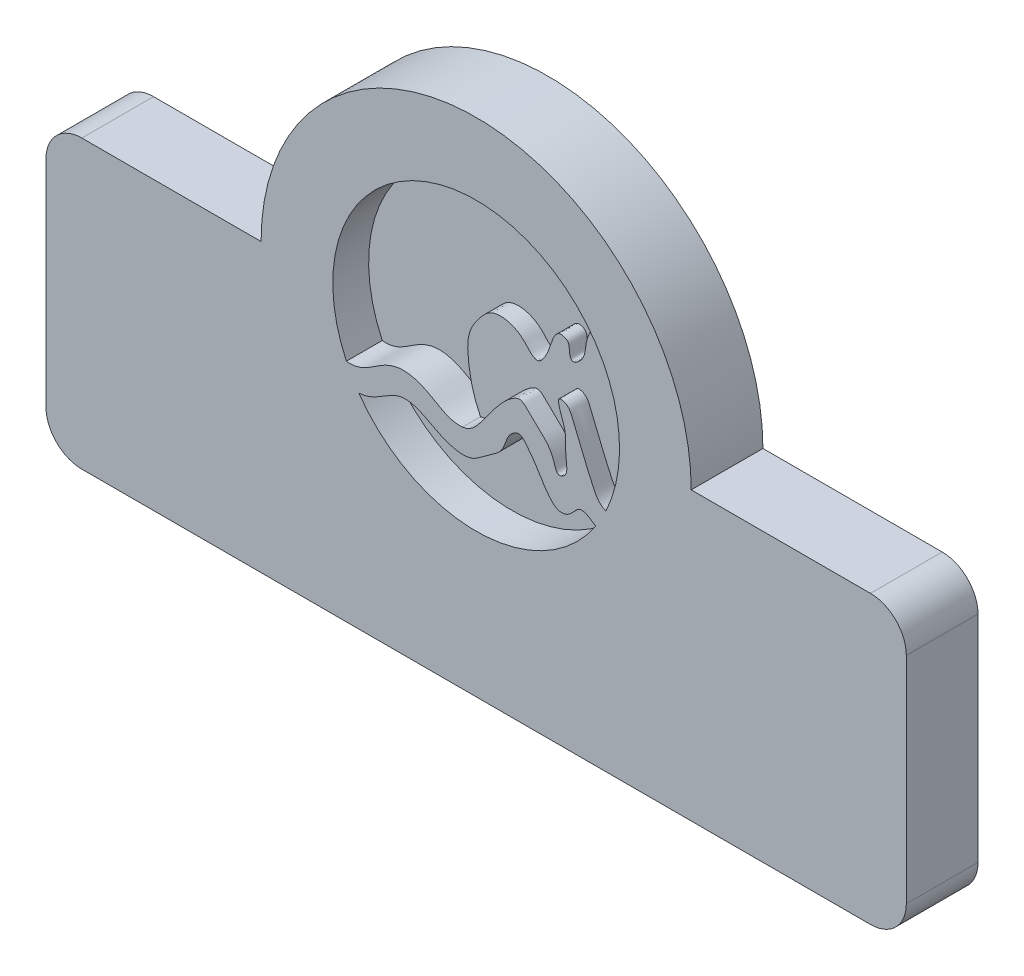
ISO-10303-21;
HEADER;
FILE_DESCRIPTION(('STEP AP214'),'2;1');
FILE_NAME('part.step','',(''),(''),'','','');
FILE_SCHEMA(('AUTOMOTIVE_DESIGN { 1 0 10303 214 1 1 1 1 }'));
ENDSEC;
DATA;
#1=APPLICATION_CONTEXT('core data for automotive mechanical design processes');
#2=APPLICATION_PROTOCOL_DEFINITION('international standard','automotive_design',2000,#1);
#3=PRODUCT_CONTEXT('',#1,'mechanical');
#4=PRODUCT('Part','Part','',(#3));
#5=PRODUCT_RELATED_PRODUCT_CATEGORY('part','',(#4));
#6=PRODUCT_DEFINITION_FORMATION('','',#4);
#7=PRODUCT_DEFINITION_CONTEXT('part definition',#1,'design');
#8=PRODUCT_DEFINITION('design','',#6,#7);
#9=PRODUCT_DEFINITION_SHAPE('','',#8);
#10=(LENGTH_UNIT() NAMED_UNIT(*) SI_UNIT(.MILLI.,.METRE.));
#11=(NAMED_UNIT(*) PLANE_ANGLE_UNIT() SI_UNIT($,.RADIAN.));
#12=(NAMED_UNIT(*) SI_UNIT($,.STERADIAN.) SOLID_ANGLE_UNIT());
#13=UNCERTAINTY_MEASURE_WITH_UNIT(LENGTH_MEASURE(1.E-05),#10,'distance_accuracy_value','');
#14=(GEOMETRIC_REPRESENTATION_CONTEXT(3) GLOBAL_UNCERTAINTY_ASSIGNED_CONTEXT((#13)) GLOBAL_UNIT_ASSIGNED_CONTEXT((#10,
#11,#12)) REPRESENTATION_CONTEXT('',''));
#15=CARTESIAN_POINT('',(0.,0.,0.));
#16=DIRECTION('',(0.,0.,1.));
#17=DIRECTION('',(1.,0.,0.));
#18=AXIS2_PLACEMENT_3D('',#15,#16,#17);
#19=CARTESIAN_POINT('',(15.5302636255831,10.8282867655375,3.175));
#20=CARTESIAN_POINT('',(14.8939400814353,12.095087950839,3.175));
#21=CARTESIAN_POINT('',(14.4388683424754,13.9812628329786,3.175));
#22=CARTESIAN_POINT('',(14.3435376753048,16.7342572903243,3.175));
#23=CARTESIAN_POINT('',(15.2690820113943,18.2447230478923,3.175));
#24=CARTESIAN_POINT('',(16.5062417067426,19.5074156895581,3.175));
#25=CARTESIAN_POINT('',(18.1400341357042,19.4662167540936,3.175));
#26=CARTESIAN_POINT('',(19.3320027450902,18.7361806333531,3.175));
#27=CARTESIAN_POINT('',(19.9024481651618,17.9654679208199,3.175));
#28=CARTESIAN_POINT('',(20.6817431216853,17.4715706074241,3.175));
#29=CARTESIAN_POINT('',(21.448331705191,18.5090316874533,3.175));
#30=CARTESIAN_POINT('',(21.7333698693151,19.5035376140276,3.175));
#31=CARTESIAN_POINT('',(22.2913050843866,20.9390720189672,3.175));
#32=CARTESIAN_POINT('',(23.5141092084125,20.4968895674322,3.175));
#33=CARTESIAN_POINT('',(23.3329728338759,19.7355430144696,3.175));
#34=CARTESIAN_POINT('',(23.67873827835,18.9513492838782,3.175));
#35=CARTESIAN_POINT('',(24.8928291355082,19.8566339972601,3.175));
#36=CARTESIAN_POINT('',(24.7040697825867,21.7985625785221,3.175));
#37=CARTESIAN_POINT('',(25.9370407985922,23.3157792325648,3.175));
#38=CARTESIAN_POINT('',(26.6865750307459,24.0301124446115,3.175));
#39=B_SPLINE_CURVE_WITH_KNOTS('',3,(#19,#20,#21,#22,#23,#24,#25,#26,#27,#28,#29,#30,#31,#32,#33,
#34,#35,#36,#37,#38),.UNSPECIFIED.,.F.,.F.,(4,1,1,1,1,1,1,1,1,1,1,1,1,1,1,1,1,4),(0.,
0.163826767800243,0.228294741353153,0.314759461357509,0.363733254666579,0.427293953650554,
0.487534151582899,0.520272146887113,0.543412506941602,0.580045632622776,0.637017642997619,
0.689480467875241,0.715613553959925,0.754599817932839,0.768000955969037,0.802503201173287,
0.870835865524209,1.),.UNSPECIFIED.);
#40=DIRECTION('',(0.,0.,1.));
#41=VECTOR('',#40,1.);
#42=SURFACE_OF_LINEAR_EXTRUSION('',#39,#41);
#43=CARTESIAN_POINT('',(15.5302636255831,10.8282867655375,4.7625));
#44=CARTESIAN_POINT('',(14.8939400814353,12.095087950839,4.7625));
#45=CARTESIAN_POINT('',(14.4388683424754,13.9812628329786,4.7625));
#46=CARTESIAN_POINT('',(14.3435376753048,16.7342572903243,4.7625));
#47=CARTESIAN_POINT('',(15.2690820113943,18.2447230478923,4.7625));
#48=CARTESIAN_POINT('',(16.5062417067426,19.5074156895581,4.7625));
#49=CARTESIAN_POINT('',(18.1400341357042,19.4662167540936,4.7625));
#50=CARTESIAN_POINT('',(19.3320027450902,18.7361806333531,4.7625));
#51=CARTESIAN_POINT('',(19.9024481651618,17.9654679208199,4.7625));
#52=CARTESIAN_POINT('',(20.6817431216853,17.4715706074241,4.7625));
#53=CARTESIAN_POINT('',(21.448331705191,18.5090316874532,4.7625));
#54=CARTESIAN_POINT('',(21.7333698693151,19.5035376140276,4.7625));
#55=CARTESIAN_POINT('',(22.2913050843866,20.9390720189672,4.7625));
#56=CARTESIAN_POINT('',(23.5141092084125,20.4968895674322,4.7625));
#57=CARTESIAN_POINT('',(23.3329728338759,19.7355430144696,4.7625));
#58=CARTESIAN_POINT('',(23.67873827835,18.9513492838782,4.7625));
#59=CARTESIAN_POINT('',(24.8928291355082,19.8566339972601,4.7625));
#60=CARTESIAN_POINT('',(24.7040697825867,21.7985625785221,4.7625));
#61=CARTESIAN_POINT('',(25.9370407985922,23.3157792325648,4.7625));
#62=CARTESIAN_POINT('',(26.6865750307459,24.0301124446115,4.7625));
#63=B_SPLINE_CURVE_WITH_KNOTS('',3,(#43,#44,#45,#46,#47,#48,#49,#50,#51,#52,#53,#54,#55,#56,#57,
#58,#59,#60,#61,#62),.UNSPECIFIED.,.F.,.F.,(4,1,1,1,1,1,1,1,1,1,1,1,1,1,1,1,1,4),(0.,
0.163826767800243,0.228294741353153,0.314759461357509,0.363733254666579,0.427293953650554,
0.487534151582899,0.520272146887113,0.543412506941602,0.580045632622776,0.637017642997619,
0.689480467875241,0.715613553959925,0.754599817932839,0.768000955969037,0.802503201173287,
0.870835865524209,1.),.UNSPECIFIED.);
#64=CARTESIAN_POINT('',(15.530263623224,10.8282867652558,4.7625));
#65=VERTEX_POINT('',#64);
#66=CARTESIAN_POINT('',(26.6865750307459,24.0301124446115,4.7625));
#67=VERTEX_POINT('',#66);
#68=EDGE_CURVE('E186',#65,#67,#63,.T.);
#69=ORIENTED_EDGE('',*,*,#68,.T.);
#70=DIRECTION('',(0.,0.,1.));
#71=VECTOR('',#70,1.);
#72=CARTESIAN_POINT('',(26.6865750307459,24.0301124446115,3.175));
#73=LINE('',#72,#71);
#74=CARTESIAN_POINT('',(26.6865750307459,24.0301124446115,3.175));
#75=VERTEX_POINT('',#74);
#76=EDGE_CURVE('E196',#75,#67,#73,.T.);
#77=ORIENTED_EDGE('',*,*,#76,.F.);
#78=CARTESIAN_POINT('',(15.530263623224,10.8282867652558,3.175));
#79=VERTEX_POINT('',#78);
#80=EDGE_CURVE('E348',#79,#75,#39,.T.);
#81=ORIENTED_EDGE('',*,*,#80,.F.);
#82=DIRECTION('',(0.,0.,1.));
#83=VECTOR('',#82,1.);
#84=CARTESIAN_POINT('',(15.530263623224,10.8282867652558,3.175));
#85=LINE('',#84,#83);
#86=EDGE_CURVE('E198',#79,#65,#85,.T.);
#87=ORIENTED_EDGE('',*,*,#86,.T.);
#88=EDGE_LOOP('',(#69,#77,#81,#87));
#89=FACE_BOUND('',#88,.T.);
#90=ADVANCED_FACE('F65',(#89),#42,.F.);
#91=CARTESIAN_POINT('',(16.7353149695587,16.1394582768876,6.35));
#92=DIRECTION('',(0.,0.,1.));
#93=DIRECTION('',(1.,0.,0.));
#94=AXIS2_PLACEMENT_3D('',#91,#92,#93);
#95=PLANE('',#94);
#96=CARTESIAN_POINT('',(16.7353149695587,16.1394582768876,6.35));
#97=DIRECTION('',(0.,0.,1.));
#98=DIRECTION('',(1.,0.,0.));
#99=AXIS2_PLACEMENT_3D('',#96,#97,#98);
#100=CIRCLE('',#99,12.7);
#101=CARTESIAN_POINT('',(28.2284558404309,10.7359674679487,6.35));
#102=VERTEX_POINT('',#101);
#103=CARTESIAN_POINT('',(5.24217409868645,10.7359674679487,6.35));
#104=VERTEX_POINT('',#103);
#105=EDGE_CURVE('E364',#102,#104,#100,.T.);
#106=ORIENTED_EDGE('',*,*,#105,.F.);
#107=CARTESIAN_POINT('',(15.530263623224,10.8282867652558,6.35));
#108=CARTESIAN_POINT('',(15.6263875327098,10.8397612740256,6.35));
#109=CARTESIAN_POINT('',(16.4897774803803,11.0116234233751,6.35));
#110=CARTESIAN_POINT('',(17.4991508982318,12.5178776573258,6.35));
#111=CARTESIAN_POINT('',(18.6877190372775,14.1014583521492,6.35));
#112=CARTESIAN_POINT('',(19.6579399153575,15.1072457767917,6.35));
#113=CARTESIAN_POINT('',(20.7365942091424,15.6711403370614,6.35));
#114=CARTESIAN_POINT('',(21.5924143850138,14.6574307728109,6.35));
#115=CARTESIAN_POINT('',(22.7185605146398,13.7475085461238,6.35));
#116=CARTESIAN_POINT('',(23.5698295134374,12.7032800384112,6.35));
#117=CARTESIAN_POINT('',(23.8625939485116,11.2745807664498,6.35));
#118=CARTESIAN_POINT('',(24.9533623804991,11.6978195279501,6.35));
#119=CARTESIAN_POINT('',(24.5406586001507,13.3497868624274,6.35));
#120=CARTESIAN_POINT('',(24.8082580394684,15.1397570692778,6.35));
#121=CARTESIAN_POINT('',(24.0950168556002,16.3011618970305,6.35));
#122=CARTESIAN_POINT('',(23.998924349624,17.331566415853,6.35));
#123=CARTESIAN_POINT('',(24.9340287374693,17.3133291685319,6.35));
#124=CARTESIAN_POINT('',(25.3682131220015,16.0394970111106,6.35));
#125=CARTESIAN_POINT('',(25.9914607242334,14.7264604105497,6.35));
#126=CARTESIAN_POINT('',(26.4067642072258,13.484600274914,6.35));
#127=CARTESIAN_POINT('',(27.1285210517247,12.1460637718713,6.35));
#128=CARTESIAN_POINT('',(27.3699983663482,11.1039666920429,6.35));
#129=CARTESIAN_POINT('',(28.2284558404309,10.7359674679487,6.35));
#130=B_SPLINE_CURVE_WITH_KNOTS('',3,(#107,#108,#109,#110,#111,#112,#113,#114,#115,#116,#117,
#118,#119,#120,#121,#122,#123,#124,#125,#126,#127,#128,#129),.UNSPECIFIED.,.F.,.F.,(4,1,1,1,1,1,
1,1,1,1,1,1,1,1,1,1,1,1,1,1,4),(0.,0.011050182170179,0.101663978881151,0.17871774043226,
0.2398084193138,0.261334575486934,0.30267670358728,0.362485617291473,0.431140663247146,
0.466715184791967,0.48049589415875,0.541262416129913,0.614557137004172,0.688187919800535,
0.698682995378061,0.711872221390112,0.768164647392276,0.828781754232407,0.883162326200238,
0.913177710886957,1.),.UNSPECIFIED.);
#131=CARTESIAN_POINT('',(15.530263623224,10.8282867652558,6.35));
#132=VERTEX_POINT('',#131);
#133=EDGE_CURVE('E199',#132,#102,#130,.T.);
#134=ORIENTED_EDGE('',*,*,#133,.F.);
#135=CARTESIAN_POINT('',(5.24217409868645,10.7359674679487,6.35));
#136=CARTESIAN_POINT('',(6.71809569007158,10.5583363116698,6.35));
#137=CARTESIAN_POINT('',(7.9181175137713,12.0334760895931,6.35));
#138=CARTESIAN_POINT('',(10.468854721958,12.7659447435013,6.35));
#139=CARTESIAN_POINT('',(12.4429037284296,12.0981408705217,6.35));
#140=CARTESIAN_POINT('',(13.96195965726,10.9880709361981,6.35));
#141=CARTESIAN_POINT('',(15.1245649700237,10.779857682638,6.35));
#142=CARTESIAN_POINT('',(15.530263623224,10.8282867652558,6.35));
#143=B_SPLINE_CURVE_WITH_KNOTS('',3,(#135,#136,#137,#138,#139,#140,#141,#142),.UNSPECIFIED.,.F.,
.F.,(4,1,1,1,1,4),(0.,0.354717448601886,0.477446205127706,0.704908306196086,0.886720300989239,
1.),.UNSPECIFIED.);
#144=EDGE_CURVE('E354',#104,#132,#143,.T.);
#145=ORIENTED_EDGE('',*,*,#144,.F.);
#146=EDGE_LOOP('',(#106,#134,#145));
#147=FACE_BOUND('',#146,.T.);
#148=DIRECTION('',(0.,1.,0.));
#149=VECTOR('',#148,1.);
#150=CARTESIAN_POINT('',(54.8353149695587,-9.26054172311241,6.35));
#151=LINE('',#150,#149);
#152=CARTESIAN_POINT('',(54.8353149695587,-6.08554172311241,6.35));
#153=VERTEX_POINT('',#152);
#154=CARTESIAN_POINT('',(54.8353149695587,12.9644582768876,6.35));
#155=VERTEX_POINT('',#154);
#156=EDGE_CURVE('E232',#153,#155,#151,.T.);
#157=ORIENTED_EDGE('',*,*,#156,.T.);
#158=CARTESIAN_POINT('',(51.6603149695587,12.9644582768876,6.35));
#159=DIRECTION('',(0.,0.,1.));
#160=DIRECTION('',(1.,0.,0.));
#161=AXIS2_PLACEMENT_3D('',#158,#159,#160);
#162=CIRCLE('',#161,3.175);
#163=CARTESIAN_POINT('',(51.6603149695587,16.1394582768876,6.35));
#164=VERTEX_POINT('',#163);
#165=EDGE_CURVE('E288',#155,#164,#162,.T.);
#166=ORIENTED_EDGE('',*,*,#165,.T.);
#167=DIRECTION('',(-1.,0.,0.));
#168=VECTOR('',#167,1.);
#169=CARTESIAN_POINT('',(35.7853149695587,16.1394582768876,6.35));
#170=LINE('',#169,#168);
#171=CARTESIAN_POINT('',(35.7853149695587,16.1394582768876,6.35));
#172=VERTEX_POINT('',#171);
#173=EDGE_CURVE('E235',#164,#172,#170,.T.);
#174=ORIENTED_EDGE('',*,*,#173,.T.);
#175=CARTESIAN_POINT('',(16.7353149695587,16.1394582768876,6.35));
#176=DIRECTION('',(0.,0.,1.));
#177=DIRECTION('',(1.,0.,0.));
#178=AXIS2_PLACEMENT_3D('',#175,#176,#177);
#179=CIRCLE('',#178,19.05);
#180=CARTESIAN_POINT('',(-2.31468503044133,16.1394582768876,6.35));
#181=VERTEX_POINT('',#180);
#182=EDGE_CURVE('E221',#172,#181,#179,.T.);
#183=ORIENTED_EDGE('',*,*,#182,.T.);
#184=DIRECTION('',(-1.,0.,0.));
#185=VECTOR('',#184,1.);
#186=CARTESIAN_POINT('',(-21.3646850304413,16.1394582768876,6.35));
#187=LINE('',#186,#185);
#188=CARTESIAN_POINT('',(-18.1896850304413,16.1394582768876,6.35));
#189=VERTEX_POINT('',#188);
#190=EDGE_CURVE('E224',#181,#189,#187,.T.);
#191=ORIENTED_EDGE('',*,*,#190,.T.);
#192=CARTESIAN_POINT('',(-18.1896850304413,12.9644582768876,6.35));
#193=DIRECTION('',(0.,0.,1.));
#194=DIRECTION('',(1.,0.,0.));
#195=AXIS2_PLACEMENT_3D('',#192,#193,#194);
#196=CIRCLE('',#195,3.175);
#197=CARTESIAN_POINT('',(-21.3646850304413,12.9644582768876,6.35));
#198=VERTEX_POINT('',#197);
#199=EDGE_CURVE('E283',#189,#198,#196,.T.);
#200=ORIENTED_EDGE('',*,*,#199,.T.);
#201=DIRECTION('',(0.,-1.,0.));
#202=VECTOR('',#201,1.);
#203=CARTESIAN_POINT('',(-21.3646850304413,-9.26054172311241,6.35));
#204=LINE('',#203,#202);
#205=CARTESIAN_POINT('',(-21.3646850304413,-6.08554172311241,6.35));
#206=VERTEX_POINT('',#205);
#207=EDGE_CURVE('E228',#198,#206,#204,.T.);
#208=ORIENTED_EDGE('',*,*,#207,.T.);
#209=CARTESIAN_POINT('',(-18.1896850304413,-6.08554172311241,6.35));
#210=DIRECTION('',(0.,0.,1.));
#211=DIRECTION('',(1.,0.,0.));
#212=AXIS2_PLACEMENT_3D('',#209,#210,#211);
#213=CIRCLE('',#212,3.175);
#214=CARTESIAN_POINT('',(-18.1896850304413,-9.26054172311241,6.35));
#215=VERTEX_POINT('',#214);
#216=EDGE_CURVE('E87',#206,#215,#213,.T.);
#217=ORIENTED_EDGE('',*,*,#216,.T.);
#218=DIRECTION('',(1.,0.,0.));
#219=VECTOR('',#218,1.);
#220=CARTESIAN_POINT('',(-21.3646850304413,-9.26054172311241,6.35));
#221=LINE('',#220,#219);
#222=CARTESIAN_POINT('',(51.6603149695586,-9.26054172311241,6.35));
#223=VERTEX_POINT('',#222);
#224=EDGE_CURVE('E230',#215,#223,#221,.T.);
#225=ORIENTED_EDGE('',*,*,#224,.T.);
#226=CARTESIAN_POINT('',(51.6603149695587,-6.08554172311241,6.35));
#227=DIRECTION('',(0.,0.,1.));
#228=DIRECTION('',(1.,0.,0.));
#229=AXIS2_PLACEMENT_3D('',#226,#227,#228);
#230=CIRCLE('',#229,3.175);
#231=EDGE_CURVE('E286',#223,#153,#230,.T.);
#232=ORIENTED_EDGE('',*,*,#231,.T.);
#233=EDGE_LOOP('',(#157,#166,#174,#183,#191,#200,#208,#217,#225,#232));
#234=FACE_BOUND('',#233,.T.);
#235=CARTESIAN_POINT('',(16.7353149695587,16.1394582768876,6.35));
#236=DIRECTION('',(0.,0.,1.));
#237=DIRECTION('',(1.,0.,0.));
#238=AXIS2_PLACEMENT_3D('',#235,#236,#237);
#239=CIRCLE('',#238,12.7);
#240=CARTESIAN_POINT('',(6.34133551897178,8.84184283204687,6.35));
#241=VERTEX_POINT('',#240);
#242=CARTESIAN_POINT('',(27.3242227262045,9.1276801485349,6.35));
#243=VERTEX_POINT('',#242);
#244=EDGE_CURVE('E391',#241,#243,#239,.T.);
#245=ORIENTED_EDGE('',*,*,#244,.F.);
#246=CARTESIAN_POINT('',(6.34133551897178,8.84184283204687,6.35));
#247=CARTESIAN_POINT('',(7.35294883387056,8.8927655582152,6.35));
#248=CARTESIAN_POINT('',(8.43974754301574,9.7203705737948,6.35));
#249=CARTESIAN_POINT('',(10.0783228223503,10.5482821721267,6.35));
#250=CARTESIAN_POINT('',(11.6015791581696,10.3367737163733,6.35));
#251=CARTESIAN_POINT('',(13.0104182815705,9.47926217741116,6.35));
#252=CARTESIAN_POINT('',(14.602994521296,8.76006985247678,6.35));
#253=CARTESIAN_POINT('',(16.3538518180501,8.62724276321636,6.35));
#254=CARTESIAN_POINT('',(17.6380599917219,9.77696458158076,6.35));
#255=CARTESIAN_POINT('',(19.2522117450946,10.6455361542986,6.35));
#256=CARTESIAN_POINT('',(19.4083323897573,12.251159056738,6.35));
#257=CARTESIAN_POINT('',(20.6019471994809,13.020559931285,6.35));
#258=CARTESIAN_POINT('',(21.5067328588053,11.9378281641538,6.35));
#259=CARTESIAN_POINT('',(22.2898184042684,10.7944864499648,6.35));
#260=CARTESIAN_POINT('',(23.0330176474701,9.45522683601884,6.35));
#261=CARTESIAN_POINT('',(23.9851834372349,8.54138472112722,6.35));
#262=CARTESIAN_POINT('',(25.1785216720955,8.78363175224099,6.35));
#263=CARTESIAN_POINT('',(25.8580537064909,10.2363822765137,6.35));
#264=CARTESIAN_POINT('',(27.0204413215573,9.32676808646791,6.35));
#265=CARTESIAN_POINT('',(27.3242227262045,9.12768014853491,6.35));
#266=B_SPLINE_CURVE_WITH_KNOTS('',3,(#246,#247,#248,#249,#250,#251,#252,#253,#254,#255,#256,
#257,#258,#259,#260,#261,#262,#263,#264,#265),.UNSPECIFIED.,.F.,.F.,(4,1,1,1,1,1,1,1,1,1,1,1,1,
1,1,1,1,4),(0.,0.111111505566851,0.158804473380793,0.207674807266992,0.281442738283734,
0.34935856682418,0.412439169497565,0.469148104339875,0.544608442597345,0.60989685081648,
0.643348875048428,0.677969983838984,0.748784790603051,0.815450655637724,0.85672693430683,
0.888904638615788,0.94263122219289,1.),.UNSPECIFIED.);
#267=EDGE_CURVE('E400',#241,#243,#266,.T.);
#268=ORIENTED_EDGE('',*,*,#267,.T.);
#269=EDGE_LOOP('',(#245,#268));
#270=FACE_BOUND('',#269,.T.);
#271=ADVANCED_FACE('F303',(#147,#234,#270),#95,.T.);
#272=CARTESIAN_POINT('',(16.7353149695587,16.1394582768876,6.35));
#273=DIRECTION('',(0.,0.,-1.));
#274=DIRECTION('',(-1.,0.,0.));
#275=AXIS2_PLACEMENT_3D('',#272,#273,#274);
#276=CYLINDRICAL_SURFACE('',#275,19.05);
#277=CARTESIAN_POINT('',(16.7353149695587,16.1394582768876,0.));
#278=DIRECTION('',(0.,0.,1.));
#279=DIRECTION('',(1.,0.,0.));
#280=AXIS2_PLACEMENT_3D('',#277,#278,#279);
#281=CIRCLE('',#280,19.05);
#282=CARTESIAN_POINT('',(35.7853149695587,16.1394582768876,0.));
#283=VERTEX_POINT('',#282);
#284=CARTESIAN_POINT('',(-2.31468503044133,16.1394582768876,0.));
#285=VERTEX_POINT('',#284);
#286=EDGE_CURVE('E238',#283,#285,#281,.T.);
#287=ORIENTED_EDGE('',*,*,#286,.T.);
#288=DIRECTION('',(0.,0.,-1.));
#289=VECTOR('',#288,1.);
#290=CARTESIAN_POINT('',(-2.31468503044133,16.1394582768876,6.35));
#291=LINE('',#290,#289);
#292=EDGE_CURVE('E215',#181,#285,#291,.T.);
#293=ORIENTED_EDGE('',*,*,#292,.F.);
#294=ORIENTED_EDGE('',*,*,#182,.F.);
#295=DIRECTION('',(0.,0.,-1.));
#296=VECTOR('',#295,1.);
#297=CARTESIAN_POINT('',(35.7853149695587,16.1394582768876,6.35));
#298=LINE('',#297,#296);
#299=EDGE_CURVE('E237',#172,#283,#298,.T.);
#300=ORIENTED_EDGE('',*,*,#299,.T.);
#301=EDGE_LOOP('',(#287,#293,#294,#300));
#302=FACE_BOUND('',#301,.T.);
#303=ADVANCED_FACE('F325',(#302),#276,.T.);
#304=CARTESIAN_POINT('',(-21.3646850304413,16.1394582768876,6.35));
#305=DIRECTION('',(0.,-1.,0.));
#306=DIRECTION('',(0.,0.,-1.));
#307=AXIS2_PLACEMENT_3D('',#304,#305,#306);
#308=PLANE('',#307);
#309=DIRECTION('',(-1.,0.,0.));
#310=VECTOR('',#309,1.);
#311=CARTESIAN_POINT('',(-21.3646850304413,16.1394582768876,0.));
#312=LINE('',#311,#310);
#313=CARTESIAN_POINT('',(-18.1896850304413,16.1394582768876,0.));
#314=VERTEX_POINT('',#313);
#315=EDGE_CURVE('E241',#285,#314,#312,.T.);
#316=ORIENTED_EDGE('',*,*,#315,.T.);
#317=DIRECTION('',(0.,0.,-1.));
#318=VECTOR('',#317,1.);
#319=CARTESIAN_POINT('',(-18.1896850304413,16.1394582768876,6.35));
#320=LINE('',#319,#318);
#321=EDGE_CURVE('E12',#314,#189,#320,.F.);
#322=ORIENTED_EDGE('',*,*,#321,.T.);
#323=ORIENTED_EDGE('',*,*,#190,.F.);
#324=ORIENTED_EDGE('',*,*,#292,.T.);
#325=EDGE_LOOP('',(#316,#322,#323,#324));
#326=FACE_BOUND('',#325,.T.);
#327=ADVANCED_FACE('F328',(#326),#308,.F.);
#328=CARTESIAN_POINT('',(-21.3646850304413,-9.26054172311241,6.35));
#329=DIRECTION('',(1.,0.,0.));
#330=DIRECTION('',(0.,0.,-1.));
#331=AXIS2_PLACEMENT_3D('',#328,#329,#330);
#332=PLANE('',#331);
#333=DIRECTION('',(0.,-1.,0.));
#334=VECTOR('',#333,1.);
#335=CARTESIAN_POINT('',(-21.3646850304413,-9.26054172311241,0.));
#336=LINE('',#335,#334);
#337=CARTESIAN_POINT('',(-21.3646850304413,12.9644582768876,0.));
#338=VERTEX_POINT('',#337);
#339=CARTESIAN_POINT('',(-21.3646850304413,-6.08554172311241,0.));
#340=VERTEX_POINT('',#339);
#341=EDGE_CURVE('E244',#338,#340,#336,.T.);
#342=ORIENTED_EDGE('',*,*,#341,.T.);
#343=DIRECTION('',(0.,0.,-1.));
#344=VECTOR('',#343,1.);
#345=CARTESIAN_POINT('',(-21.3646850304413,-6.08554172311241,6.35));
#346=LINE('',#345,#344);
#347=EDGE_CURVE('E73',#340,#206,#346,.F.);
#348=ORIENTED_EDGE('',*,*,#347,.T.);
#349=ORIENTED_EDGE('',*,*,#207,.F.);
#350=DIRECTION('',(0.,0.,-1.));
#351=VECTOR('',#350,1.);
#352=CARTESIAN_POINT('',(-21.3646850304413,12.9644582768876,6.35));
#353=LINE('',#352,#351);
#354=EDGE_CURVE('E294',#198,#338,#353,.T.);
#355=ORIENTED_EDGE('',*,*,#354,.T.);
#356=EDGE_LOOP('',(#342,#348,#349,#355));
#357=FACE_BOUND('',#356,.T.);
#358=ADVANCED_FACE('F299',(#357),#332,.F.);
#359=CARTESIAN_POINT('',(-21.3646850304413,-9.26054172311241,6.35));
#360=DIRECTION('',(0.,1.,0.));
#361=DIRECTION('',(0.,0.,1.));
#362=AXIS2_PLACEMENT_3D('',#359,#360,#361);
#363=PLANE('',#362);
#364=DIRECTION('',(1.,0.,0.));
#365=VECTOR('',#364,1.);
#366=CARTESIAN_POINT('',(-21.3646850304413,-9.26054172311241,0.));
#367=LINE('',#366,#365);
#368=CARTESIAN_POINT('',(-18.1896850304413,-9.26054172311241,0.));
#369=VERTEX_POINT('',#368);
#370=CARTESIAN_POINT('',(51.6603149695586,-9.26054172311241,0.));
#371=VERTEX_POINT('',#370);
#372=EDGE_CURVE('E247',#369,#371,#367,.T.);
#373=ORIENTED_EDGE('',*,*,#372,.T.);
#374=DIRECTION('',(0.,0.,-1.));
#375=VECTOR('',#374,1.);
#376=CARTESIAN_POINT('',(51.6603149695587,-9.26054172311241,6.35));
#377=LINE('',#376,#375);
#378=EDGE_CURVE('E80',#371,#223,#377,.F.);
#379=ORIENTED_EDGE('',*,*,#378,.T.);
#380=ORIENTED_EDGE('',*,*,#224,.F.);
#381=DIRECTION('',(0.,0.,-1.));
#382=VECTOR('',#381,1.);
#383=CARTESIAN_POINT('',(-18.1896850304413,-9.26054172311241,6.35));
#384=LINE('',#383,#382);
#385=EDGE_CURVE('E290',#215,#369,#384,.T.);
#386=ORIENTED_EDGE('',*,*,#385,.T.);
#387=EDGE_LOOP('',(#373,#379,#380,#386));
#388=FACE_BOUND('',#387,.T.);
#389=ADVANCED_FACE('F309',(#388),#363,.F.);
#390=CARTESIAN_POINT('',(54.8353149695587,-9.26054172311241,6.35));
#391=DIRECTION('',(-1.,0.,0.));
#392=DIRECTION('',(0.,0.,1.));
#393=AXIS2_PLACEMENT_3D('',#390,#391,#392);
#394=PLANE('',#393);
#395=DIRECTION('',(0.,1.,0.));
#396=VECTOR('',#395,1.);
#397=CARTESIAN_POINT('',(54.8353149695587,-9.26054172311241,0.));
#398=LINE('',#397,#396);
#399=CARTESIAN_POINT('',(54.8353149695587,-6.08554172311241,0.));
#400=VERTEX_POINT('',#399);
#401=CARTESIAN_POINT('',(54.8353149695587,12.9644582768876,0.));
#402=VERTEX_POINT('',#401);
#403=EDGE_CURVE('E249',#400,#402,#398,.T.);
#404=ORIENTED_EDGE('',*,*,#403,.T.);
#405=DIRECTION('',(0.,0.,-1.));
#406=VECTOR('',#405,1.);
#407=CARTESIAN_POINT('',(54.8353149695587,12.9644582768876,6.35));
#408=LINE('',#407,#406);
#409=EDGE_CURVE('E281',#402,#155,#408,.F.);
#410=ORIENTED_EDGE('',*,*,#409,.T.);
#411=ORIENTED_EDGE('',*,*,#156,.F.);
#412=DIRECTION('',(0.,0.,-1.));
#413=VECTOR('',#412,1.);
#414=CARTESIAN_POINT('',(54.8353149695587,-6.08554172311241,6.35));
#415=LINE('',#414,#413);
#416=EDGE_CURVE('E278',#153,#400,#415,.T.);
#417=ORIENTED_EDGE('',*,*,#416,.T.);
#418=EDGE_LOOP('',(#404,#410,#411,#417));
#419=FACE_BOUND('',#418,.T.);
#420=ADVANCED_FACE('F319',(#419),#394,.F.);
#421=CARTESIAN_POINT('',(35.7853149695587,16.1394582768876,6.35));
#422=DIRECTION('',(0.,-1.,0.));
#423=DIRECTION('',(0.,0.,-1.));
#424=AXIS2_PLACEMENT_3D('',#421,#422,#423);
#425=PLANE('',#424);
#426=ORIENTED_EDGE('',*,*,#173,.F.);
#427=DIRECTION('',(0.,0.,-1.));
#428=VECTOR('',#427,1.);
#429=CARTESIAN_POINT('',(51.6603149695587,16.1394582768876,6.35));
#430=LINE('',#429,#428);
#431=CARTESIAN_POINT('',(51.6603149695587,16.1394582768876,0.));
#432=VERTEX_POINT('',#431);
#433=EDGE_CURVE('E258',#164,#432,#430,.T.);
#434=ORIENTED_EDGE('',*,*,#433,.T.);
#435=DIRECTION('',(-1.,0.,0.));
#436=VECTOR('',#435,1.);
#437=CARTESIAN_POINT('',(35.7853149695587,16.1394582768876,0.));
#438=LINE('',#437,#436);
#439=EDGE_CURVE('E225',#432,#283,#438,.T.);
#440=ORIENTED_EDGE('',*,*,#439,.T.);
#441=ORIENTED_EDGE('',*,*,#299,.F.);
#442=EDGE_LOOP('',(#426,#434,#440,#441));
#443=FACE_BOUND('',#442,.T.);
#444=ADVANCED_FACE('F324',(#443),#425,.F.);
#445=CARTESIAN_POINT('',(16.7353149695587,16.1394582768876,0.));
#446=DIRECTION('',(0.,0.,1.));
#447=DIRECTION('',(1.,0.,0.));
#448=AXIS2_PLACEMENT_3D('',#445,#446,#447);
#449=PLANE('',#448);
#450=ORIENTED_EDGE('',*,*,#439,.F.);
#451=CARTESIAN_POINT('',(51.6603149695587,12.9644582768876,0.));
#452=DIRECTION('',(0.,0.,1.));
#453=DIRECTION('',(1.,0.,0.));
#454=AXIS2_PLACEMENT_3D('',#451,#452,#453);
#455=CIRCLE('',#454,3.175);
#456=EDGE_CURVE('E276',#432,#402,#455,.F.);
#457=ORIENTED_EDGE('',*,*,#456,.T.);
#458=ORIENTED_EDGE('',*,*,#403,.F.);
#459=CARTESIAN_POINT('',(51.6603149695587,-6.08554172311241,0.));
#460=DIRECTION('',(0.,0.,1.));
#461=DIRECTION('',(1.,0.,0.));
#462=AXIS2_PLACEMENT_3D('',#459,#460,#461);
#463=CIRCLE('',#462,3.175);
#464=EDGE_CURVE('E274',#400,#371,#463,.F.);
#465=ORIENTED_EDGE('',*,*,#464,.T.);
#466=ORIENTED_EDGE('',*,*,#372,.F.);
#467=CARTESIAN_POINT('',(-18.1896850304413,-6.08554172311241,0.));
#468=DIRECTION('',(0.,0.,1.));
#469=DIRECTION('',(1.,0.,0.));
#470=AXIS2_PLACEMENT_3D('',#467,#468,#469);
#471=CIRCLE('',#470,3.175);
#472=EDGE_CURVE('E268',#369,#340,#471,.F.);
#473=ORIENTED_EDGE('',*,*,#472,.T.);
#474=ORIENTED_EDGE('',*,*,#341,.F.);
#475=CARTESIAN_POINT('',(-18.1896850304413,12.9644582768876,0.));
#476=DIRECTION('',(0.,0.,1.));
#477=DIRECTION('',(1.,0.,0.));
#478=AXIS2_PLACEMENT_3D('',#475,#476,#477);
#479=CIRCLE('',#478,3.175);
#480=EDGE_CURVE('E262',#338,#314,#479,.F.);
#481=ORIENTED_EDGE('',*,*,#480,.T.);
#482=ORIENTED_EDGE('',*,*,#315,.F.);
#483=ORIENTED_EDGE('',*,*,#286,.F.);
#484=EDGE_LOOP('',(#450,#457,#458,#465,#466,#473,#474,#481,#482,#483));
#485=FACE_BOUND('',#484,.T.);
#486=ADVANCED_FACE('F311',(#485),#449,.F.);
#487=CARTESIAN_POINT('',(5.24217409868645,10.7359674679487,3.175));
#488=CARTESIAN_POINT('',(6.71809569007158,10.5583363116698,3.175));
#489=CARTESIAN_POINT('',(7.9181175137713,12.0334760895931,3.175));
#490=CARTESIAN_POINT('',(10.468854721958,12.7659447435013,3.175));
#491=CARTESIAN_POINT('',(12.4429037284296,12.0981408705217,3.175));
#492=CARTESIAN_POINT('',(13.96195965726,10.9880709361981,3.175));
#493=CARTESIAN_POINT('',(15.1245649700237,10.779857682638,3.175));
#494=CARTESIAN_POINT('',(15.530263623224,10.8282867652558,3.175));
#495=B_SPLINE_CURVE_WITH_KNOTS('',3,(#487,#488,#489,#490,#491,#492,#493,#494),.UNSPECIFIED.,.F.,
.F.,(4,1,1,1,1,4),(0.,0.354717448601886,0.477446205127706,0.704908306196086,0.886720300989239,
1.),.UNSPECIFIED.);
#496=DIRECTION('',(0.,0.,1.));
#497=VECTOR('',#496,1.);
#498=SURFACE_OF_LINEAR_EXTRUSION('',#495,#497);
#499=ORIENTED_EDGE('',*,*,#144,.T.);
#500=DIRECTION('',(0.,0.,1.));
#501=VECTOR('',#500,1.);
#502=CARTESIAN_POINT('',(15.530263623224,10.8282867652558,4.7625));
#503=LINE('',#502,#501);
#504=EDGE_CURVE('E422',#65,#132,#503,.T.);
#505=ORIENTED_EDGE('',*,*,#504,.F.);
#506=ORIENTED_EDGE('',*,*,#86,.F.);
#507=CARTESIAN_POINT('',(5.24217409868645,10.7359674679487,3.175));
#508=VERTEX_POINT('',#507);
#509=EDGE_CURVE('E207',#508,#79,#495,.T.);
#510=ORIENTED_EDGE('',*,*,#509,.F.);
#511=DIRECTION('',(0.,0.,1.));
#512=VECTOR('',#511,1.);
#513=CARTESIAN_POINT('',(5.24217409868645,10.7359674679487,3.175));
#514=LINE('',#513,#512);
#515=EDGE_CURVE('E206',#508,#104,#514,.T.);
#516=ORIENTED_EDGE('',*,*,#515,.T.);
#517=EDGE_LOOP('',(#499,#505,#506,#510,#516));
#518=FACE_BOUND('',#517,.T.);
#519=ADVANCED_FACE('F369',(#518),#498,.F.);
#520=CARTESIAN_POINT('',(16.7353149695587,16.1394582768876,3.175));
#521=DIRECTION('',(0.,0.,1.));
#522=DIRECTION('',(1.,0.,0.));
#523=AXIS2_PLACEMENT_3D('',#520,#521,#522);
#524=CYLINDRICAL_SURFACE('',#523,12.7);
#525=ORIENTED_EDGE('',*,*,#105,.T.);
#526=ORIENTED_EDGE('',*,*,#515,.F.);
#527=CARTESIAN_POINT('',(16.7353149695587,16.1394582768876,3.175));
#528=DIRECTION('',(0.,0.,1.));
#529=DIRECTION('',(1.,0.,0.));
#530=AXIS2_PLACEMENT_3D('',#527,#528,#529);
#531=CIRCLE('',#530,12.7);
#532=EDGE_CURVE('E204',#75,#508,#531,.T.);
#533=ORIENTED_EDGE('',*,*,#532,.F.);
#534=ORIENTED_EDGE('',*,*,#76,.T.);
#535=CARTESIAN_POINT('',(16.7353149695587,16.1394582768876,4.7625));
#536=DIRECTION('',(0.,0.,1.));
#537=DIRECTION('',(1.,0.,0.));
#538=AXIS2_PLACEMENT_3D('',#535,#536,#537);
#539=CIRCLE('',#538,12.7);
#540=CARTESIAN_POINT('',(28.2284558404309,10.7359674679487,4.7625));
#541=VERTEX_POINT('',#540);
#542=EDGE_CURVE('E183',#541,#67,#539,.T.);
#543=ORIENTED_EDGE('',*,*,#542,.F.);
#544=DIRECTION('',(0.,0.,1.));
#545=VECTOR('',#544,1.);
#546=CARTESIAN_POINT('',(28.2284558404309,10.7359674679487,4.7625));
#547=LINE('',#546,#545);
#548=EDGE_CURVE('E392',#541,#102,#547,.T.);
#549=ORIENTED_EDGE('',*,*,#548,.T.);
#550=EDGE_LOOP('',(#525,#526,#533,#534,#543,#549));
#551=FACE_BOUND('',#550,.T.);
#552=ADVANCED_FACE('F202',(#551),#524,.F.);
#553=CARTESIAN_POINT('',(19.6471531501777,18.3013952661754,3.175));
#554=DIRECTION('',(0.,0.,1.));
#555=DIRECTION('',(1.,0.,0.));
#556=AXIS2_PLACEMENT_3D('',#553,#554,#555);
#557=PLANE('',#556);
#558=ORIENTED_EDGE('',*,*,#80,.T.);
#559=ORIENTED_EDGE('',*,*,#532,.T.);
#560=ORIENTED_EDGE('',*,*,#509,.T.);
#561=EDGE_LOOP('',(#558,#559,#560));
#562=FACE_BOUND('',#561,.T.);
#563=ADVANCED_FACE('F373',(#562),#557,.T.);
#564=CARTESIAN_POINT('',(6.34133551897178,8.84184283204687,3.175));
#565=CARTESIAN_POINT('',(7.35294883387056,8.8927655582152,3.175));
#566=CARTESIAN_POINT('',(8.43974754301574,9.7203705737948,3.175));
#567=CARTESIAN_POINT('',(10.0783228223503,10.5482821721267,3.175));
#568=CARTESIAN_POINT('',(11.6015791581696,10.3367737163733,3.175));
#569=CARTESIAN_POINT('',(13.0104182815705,9.47926217741116,3.175));
#570=CARTESIAN_POINT('',(14.602994521296,8.76006985247678,3.175));
#571=CARTESIAN_POINT('',(16.3538518180501,8.62724276321636,3.175));
#572=CARTESIAN_POINT('',(17.6380599917219,9.77696458158076,3.175));
#573=CARTESIAN_POINT('',(19.2522117450946,10.6455361542986,3.175));
#574=CARTESIAN_POINT('',(19.4083323897573,12.251159056738,3.175));
#575=CARTESIAN_POINT('',(20.6019471994809,13.020559931285,3.175));
#576=CARTESIAN_POINT('',(21.5067328588053,11.9378281641538,3.175));
#577=CARTESIAN_POINT('',(22.2898184042684,10.7944864499648,3.175));
#578=CARTESIAN_POINT('',(23.0330176474701,9.45522683601884,3.175));
#579=CARTESIAN_POINT('',(23.9851834372349,8.54138472112722,3.175));
#580=CARTESIAN_POINT('',(25.1785216720955,8.78363175224099,3.175));
#581=CARTESIAN_POINT('',(25.8580537064909,10.2363822765137,3.175));
#582=CARTESIAN_POINT('',(27.0204413215573,9.32676808646791,3.175));
#583=CARTESIAN_POINT('',(27.3242227262045,9.12768014853491,3.175));
#584=B_SPLINE_CURVE_WITH_KNOTS('',3,(#564,#565,#566,#567,#568,#569,#570,#571,#572,#573,#574,
#575,#576,#577,#578,#579,#580,#581,#582,#583),.UNSPECIFIED.,.F.,.F.,(4,1,1,1,1,1,1,1,1,1,1,1,1,
1,1,1,1,4),(0.,0.111111505566851,0.158804473380793,0.207674807266992,0.281442738283734,
0.34935856682418,0.412439169497565,0.469148104339875,0.544608442597345,0.60989685081648,
0.643348875048428,0.677969983838984,0.748784790603051,0.815450655637724,0.85672693430683,
0.888904638615788,0.94263122219289,1.),.UNSPECIFIED.);
#585=DIRECTION('',(0.,0.,1.));
#586=VECTOR('',#585,1.);
#587=SURFACE_OF_LINEAR_EXTRUSION('',#584,#586);
#588=ORIENTED_EDGE('',*,*,#267,.F.);
#589=DIRECTION('',(0.,0.,1.));
#590=VECTOR('',#589,1.);
#591=CARTESIAN_POINT('',(6.34133551897178,8.84184283204687,3.175));
#592=LINE('',#591,#590);
#593=CARTESIAN_POINT('',(6.34133551897178,8.84184283204687,3.175));
#594=VERTEX_POINT('',#593);
#595=EDGE_CURVE('E399',#594,#241,#592,.T.);
#596=ORIENTED_EDGE('',*,*,#595,.F.);
#597=CARTESIAN_POINT('',(27.3242227262045,9.1276801485349,3.175));
#598=VERTEX_POINT('',#597);
#599=EDGE_CURVE('E384',#594,#598,#584,.T.);
#600=ORIENTED_EDGE('',*,*,#599,.T.);
#601=DIRECTION('',(0.,0.,1.));
#602=VECTOR('',#601,1.);
#603=CARTESIAN_POINT('',(27.3242227262045,9.1276801485349,3.175));
#604=LINE('',#603,#602);
#605=EDGE_CURVE('E355',#598,#243,#604,.T.);
#606=ORIENTED_EDGE('',*,*,#605,.T.);
#607=EDGE_LOOP('',(#588,#596,#600,#606));
#608=FACE_BOUND('',#607,.T.);
#609=ADVANCED_FACE('F376',(#608),#587,.T.);
#610=CARTESIAN_POINT('',(16.7353149695587,16.1394582768876,3.175));
#611=DIRECTION('',(0.,0.,1.));
#612=DIRECTION('',(1.,0.,0.));
#613=AXIS2_PLACEMENT_3D('',#610,#611,#612);
#614=CYLINDRICAL_SURFACE('',#613,12.7);
#615=ORIENTED_EDGE('',*,*,#244,.T.);
#616=ORIENTED_EDGE('',*,*,#605,.F.);
#617=CARTESIAN_POINT('',(16.7353149695587,16.1394582768876,3.175));
#618=DIRECTION('',(0.,0.,1.));
#619=DIRECTION('',(1.,0.,0.));
#620=AXIS2_PLACEMENT_3D('',#617,#618,#619);
#621=CIRCLE('',#620,12.7);
#622=EDGE_CURVE('E390',#594,#598,#621,.T.);
#623=ORIENTED_EDGE('',*,*,#622,.F.);
#624=ORIENTED_EDGE('',*,*,#595,.T.);
#625=EDGE_LOOP('',(#615,#616,#623,#624));
#626=FACE_BOUND('',#625,.T.);
#627=ADVANCED_FACE('F381',(#626),#614,.F.);
#628=CARTESIAN_POINT('',(18.2354788468595,10.101676513741,3.175));
#629=DIRECTION('',(0.,0.,-1.));
#630=DIRECTION('',(-1.,0.,0.));
#631=AXIS2_PLACEMENT_3D('',#628,#629,#630);
#632=PLANE('',#631);
#633=ORIENTED_EDGE('',*,*,#599,.F.);
#634=ORIENTED_EDGE('',*,*,#622,.T.);
#635=EDGE_LOOP('',(#633,#634));
#636=FACE_BOUND('',#635,.T.);
#637=ADVANCED_FACE('F454',(#636),#632,.F.);
#638=CARTESIAN_POINT('',(15.530263623224,10.8282867652558,4.7625));
#639=CARTESIAN_POINT('',(15.6263875327098,10.8397612740256,4.7625));
#640=CARTESIAN_POINT('',(16.4897774803803,11.0116234233751,4.7625));
#641=CARTESIAN_POINT('',(17.4991508982318,12.5178776573258,4.7625));
#642=CARTESIAN_POINT('',(18.6877190372775,14.1014583521492,4.7625));
#643=CARTESIAN_POINT('',(19.6579399153575,15.1072457767917,4.7625));
#644=CARTESIAN_POINT('',(20.7365942091424,15.6711403370614,4.7625));
#645=CARTESIAN_POINT('',(21.5924143850138,14.6574307728109,4.7625));
#646=CARTESIAN_POINT('',(22.7185605146398,13.7475085461238,4.7625));
#647=CARTESIAN_POINT('',(23.5698295134374,12.7032800384112,4.7625));
#648=CARTESIAN_POINT('',(23.8625939485116,11.2745807664498,4.7625));
#649=CARTESIAN_POINT('',(24.9533623804991,11.6978195279501,4.7625));
#650=CARTESIAN_POINT('',(24.5406586001507,13.3497868624274,4.7625));
#651=CARTESIAN_POINT('',(24.8082580394684,15.1397570692778,4.7625));
#652=CARTESIAN_POINT('',(24.0950168556002,16.3011618970305,4.7625));
#653=CARTESIAN_POINT('',(23.998924349624,17.331566415853,4.7625));
#654=CARTESIAN_POINT('',(24.9340287374693,17.3133291685319,4.7625));
#655=CARTESIAN_POINT('',(25.3682131220015,16.0394970111106,4.7625));
#656=CARTESIAN_POINT('',(25.9914607242334,14.7264604105497,4.7625));
#657=CARTESIAN_POINT('',(26.4067642072258,13.484600274914,4.7625));
#658=CARTESIAN_POINT('',(27.1285210517247,12.1460637718713,4.7625));
#659=CARTESIAN_POINT('',(27.3699983663482,11.1039666920429,4.7625));
#660=CARTESIAN_POINT('',(28.2284558404309,10.7359674679487,4.7625));
#661=B_SPLINE_CURVE_WITH_KNOTS('',3,(#638,#639,#640,#641,#642,#643,#644,#645,#646,#647,#648,
#649,#650,#651,#652,#653,#654,#655,#656,#657,#658,#659,#660),.UNSPECIFIED.,.F.,.F.,(4,1,1,1,1,1,
1,1,1,1,1,1,1,1,1,1,1,1,1,1,4),(0.,0.011050182170179,0.101663978881151,0.17871774043226,
0.2398084193138,0.261334575486934,0.30267670358728,0.362485617291473,0.431140663247146,
0.466715184791967,0.48049589415875,0.541262416129913,0.614557137004172,0.688187919800535,
0.698682995378061,0.711872221390112,0.768164647392276,0.828781754232407,0.883162326200238,
0.913177710886957,1.),.UNSPECIFIED.);
#662=DIRECTION('',(0.,0.,1.));
#663=VECTOR('',#662,1.);
#664=SURFACE_OF_LINEAR_EXTRUSION('',#661,#663);
#665=ORIENTED_EDGE('',*,*,#133,.T.);
#666=ORIENTED_EDGE('',*,*,#548,.F.);
#667=EDGE_CURVE('E188',#65,#541,#661,.T.);
#668=ORIENTED_EDGE('',*,*,#667,.F.);
#669=ORIENTED_EDGE('',*,*,#504,.T.);
#670=EDGE_LOOP('',(#665,#666,#668,#669));
#671=FACE_BOUND('',#670,.T.);
#672=ADVANCED_FACE('F441',(#671),#664,.F.);
#673=CARTESIAN_POINT('',(19.6471531501777,18.3013952661754,4.7625));
#674=DIRECTION('',(0.,0.,1.));
#675=DIRECTION('',(1.,0.,0.));
#676=AXIS2_PLACEMENT_3D('',#673,#674,#675);
#677=PLANE('',#676);
#678=ORIENTED_EDGE('',*,*,#68,.F.);
#679=ORIENTED_EDGE('',*,*,#667,.T.);
#680=ORIENTED_EDGE('',*,*,#542,.T.);
#681=EDGE_LOOP('',(#678,#679,#680));
#682=FACE_BOUND('',#681,.T.);
#683=ADVANCED_FACE('F185',(#682),#677,.T.);
#684=CARTESIAN_POINT('',(51.6603149695587,12.9644582768876,6.35));
#685=DIRECTION('',(0.,0.,-1.));
#686=DIRECTION('',(-1.,0.,0.));
#687=AXIS2_PLACEMENT_3D('',#684,#685,#686);
#688=CYLINDRICAL_SURFACE('',#687,3.175);
#689=ORIENTED_EDGE('',*,*,#165,.F.);
#690=ORIENTED_EDGE('',*,*,#409,.F.);
#691=ORIENTED_EDGE('',*,*,#456,.F.);
#692=ORIENTED_EDGE('',*,*,#433,.F.);
#693=EDGE_LOOP('',(#689,#690,#691,#692));
#694=FACE_BOUND('',#693,.T.);
#695=ADVANCED_FACE('F323',(#694),#688,.T.);
#696=CARTESIAN_POINT('',(51.6603149695587,-6.08554172311241,6.35));
#697=DIRECTION('',(0.,0.,-1.));
#698=DIRECTION('',(-1.,0.,0.));
#699=AXIS2_PLACEMENT_3D('',#696,#697,#698);
#700=CYLINDRICAL_SURFACE('',#699,3.175);
#701=ORIENTED_EDGE('',*,*,#231,.F.);
#702=ORIENTED_EDGE('',*,*,#378,.F.);
#703=ORIENTED_EDGE('',*,*,#464,.F.);
#704=ORIENTED_EDGE('',*,*,#416,.F.);
#705=EDGE_LOOP('',(#701,#702,#703,#704));
#706=FACE_BOUND('',#705,.T.);
#707=ADVANCED_FACE('F316',(#706),#700,.T.);
#708=CARTESIAN_POINT('',(-18.1896850304413,-6.08554172311241,6.35));
#709=DIRECTION('',(0.,0.,-1.));
#710=DIRECTION('',(-1.,0.,0.));
#711=AXIS2_PLACEMENT_3D('',#708,#709,#710);
#712=CYLINDRICAL_SURFACE('',#711,3.175);
#713=ORIENTED_EDGE('',*,*,#216,.F.);
#714=ORIENTED_EDGE('',*,*,#347,.F.);
#715=ORIENTED_EDGE('',*,*,#472,.F.);
#716=ORIENTED_EDGE('',*,*,#385,.F.);
#717=EDGE_LOOP('',(#713,#714,#715,#716));
#718=FACE_BOUND('',#717,.T.);
#719=ADVANCED_FACE('F307',(#718),#712,.T.);
#720=CARTESIAN_POINT('',(-18.1896850304413,12.9644582768876,6.35));
#721=DIRECTION('',(0.,0.,-1.));
#722=DIRECTION('',(-1.,0.,0.));
#723=AXIS2_PLACEMENT_3D('',#720,#721,#722);
#724=CYLINDRICAL_SURFACE('',#723,3.175);
#725=ORIENTED_EDGE('',*,*,#199,.F.);
#726=ORIENTED_EDGE('',*,*,#321,.F.);
#727=ORIENTED_EDGE('',*,*,#480,.F.);
#728=ORIENTED_EDGE('',*,*,#354,.F.);
#729=EDGE_LOOP('',(#725,#726,#727,#728));
#730=FACE_BOUND('',#729,.T.);
#731=ADVANCED_FACE('F67',(#730),#724,.T.);
#732=CLOSED_SHELL('',(#90,#271,#303,#327,#358,#389,#420,#444,#486,#519,#552,#563,#609,#627,#637,
#672,#683,#695,#707,#719,#731));
#733=MANIFOLD_SOLID_BREP('B2',#732);
#734=ADVANCED_BREP_SHAPE_REPRESENTATION('',(#18,#733),#14);
#735=SHAPE_DEFINITION_REPRESENTATION(#9,#734);
ENDSEC;
END-ISO-10303-21;
